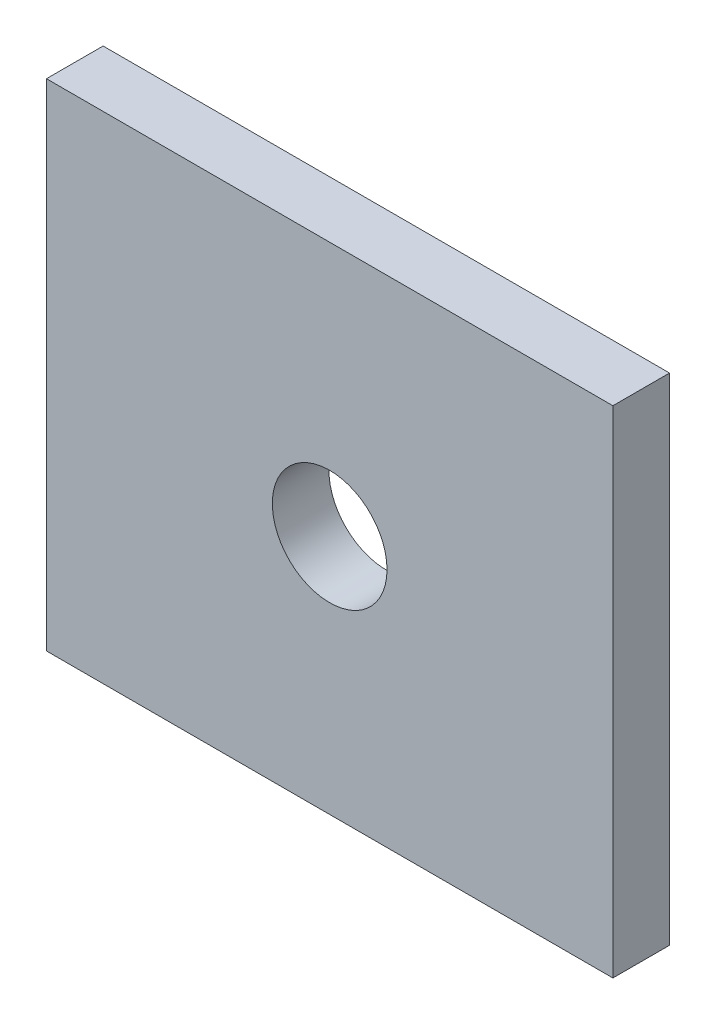
ISO-10303-21;
HEADER;
FILE_DESCRIPTION(('STEP AP214'),'2;1');
FILE_NAME('part.step','',(''),(''),'','','');
FILE_SCHEMA(('AUTOMOTIVE_DESIGN { 1 0 10303 214 1 1 1 1 }'));
ENDSEC;
DATA;
#1=APPLICATION_CONTEXT('core data for automotive mechanical design processes');
#2=APPLICATION_PROTOCOL_DEFINITION('international standard','automotive_design',2000,#1);
#3=PRODUCT_CONTEXT('',#1,'mechanical');
#4=PRODUCT('Part','Part','',(#3));
#5=PRODUCT_RELATED_PRODUCT_CATEGORY('part','',(#4));
#6=PRODUCT_DEFINITION_FORMATION('','',#4);
#7=PRODUCT_DEFINITION_CONTEXT('part definition',#1,'design');
#8=PRODUCT_DEFINITION('design','',#6,#7);
#9=PRODUCT_DEFINITION_SHAPE('','',#8);
#10=(LENGTH_UNIT() NAMED_UNIT(*) SI_UNIT(.MILLI.,.METRE.));
#11=(NAMED_UNIT(*) PLANE_ANGLE_UNIT() SI_UNIT($,.RADIAN.));
#12=(NAMED_UNIT(*) SI_UNIT($,.STERADIAN.) SOLID_ANGLE_UNIT());
#13=UNCERTAINTY_MEASURE_WITH_UNIT(LENGTH_MEASURE(1.E-05),#10,'distance_accuracy_value','');
#14=(GEOMETRIC_REPRESENTATION_CONTEXT(3) GLOBAL_UNCERTAINTY_ASSIGNED_CONTEXT((#13)) GLOBAL_UNIT_ASSIGNED_CONTEXT((#10,
#11,#12)) REPRESENTATION_CONTEXT('',''));
#15=CARTESIAN_POINT('',(0.,0.,0.));
#16=DIRECTION('',(0.,0.,1.));
#17=DIRECTION('',(1.,0.,0.));
#18=AXIS2_PLACEMENT_3D('',#15,#16,#17);
#19=CARTESIAN_POINT('',(0.,0.,0.));
#20=DIRECTION('',(0.,0.,-1.));
#21=DIRECTION('',(-1.,0.,0.));
#22=AXIS2_PLACEMENT_3D('',#19,#20,#21);
#23=PLANE('',#22);
#24=DIRECTION('',(0.,-1.,0.));
#25=VECTOR('',#24,1.);
#26=CARTESIAN_POINT('',(0.,0.,0.));
#27=LINE('',#26,#25);
#28=CARTESIAN_POINT('',(0.,35.,0.));
#29=VERTEX_POINT('',#28);
#30=CARTESIAN_POINT('',(0.,0.,0.));
#31=VERTEX_POINT('',#30);
#32=EDGE_CURVE('E112',#29,#31,#27,.T.);
#33=ORIENTED_EDGE('',*,*,#32,.F.);
#34=DIRECTION('',(-1.,0.,0.));
#35=VECTOR('',#34,1.);
#36=CARTESIAN_POINT('',(0.,35.,0.));
#37=LINE('',#36,#35);
#38=CARTESIAN_POINT('',(40.,35.,0.));
#39=VERTEX_POINT('',#38);
#40=EDGE_CURVE('E88',#39,#29,#37,.T.);
#41=ORIENTED_EDGE('',*,*,#40,.F.);
#42=DIRECTION('',(0.,1.,0.));
#43=VECTOR('',#42,1.);
#44=CARTESIAN_POINT('',(40.,0.,0.));
#45=LINE('',#44,#43);
#46=CARTESIAN_POINT('',(40.,0.,0.));
#47=VERTEX_POINT('',#46);
#48=EDGE_CURVE('E78',#47,#39,#45,.T.);
#49=ORIENTED_EDGE('',*,*,#48,.F.);
#50=DIRECTION('',(1.,0.,0.));
#51=VECTOR('',#50,1.);
#52=CARTESIAN_POINT('',(0.,0.,0.));
#53=LINE('',#52,#51);
#54=EDGE_CURVE('E105',#31,#47,#53,.T.);
#55=ORIENTED_EDGE('',*,*,#54,.F.);
#56=EDGE_LOOP('',(#33,#41,#49,#55));
#57=FACE_BOUND('',#56,.T.);
#58=CARTESIAN_POINT('',(24.05,17.,0.));
#59=CARTESIAN_POINT('',(24.0500051594344,17.0668176895687,0.));
#60=CARTESIAN_POINT('',(24.0484085186531,17.1336388053678,0.));
#61=CARTESIAN_POINT('',(24.0419805251838,17.2666462405184,0.));
#62=CARTESIAN_POINT('',(24.0371723601495,17.3328336847809,0.));
#63=CARTESIAN_POINT('',(24.0243225497178,17.4645746275891,0.));
#64=CARTESIAN_POINT('',(24.0162965270663,17.5301296441189,0.));
#65=CARTESIAN_POINT('',(23.9970204372372,17.660604950255,0.));
#66=CARTESIAN_POINT('',(23.9857780780867,17.7255263781261,0.));
#67=CARTESIAN_POINT('',(23.9600768873321,17.8547351580981,0.));
#68=CARTESIAN_POINT('',(23.9456177834944,17.9190224560511,0.));
#69=CARTESIAN_POINT('',(23.9134913767637,18.046964299905,0.));
#70=CARTESIAN_POINT('',(23.8958159842313,18.1106168134165,0.));
#71=CARTESIAN_POINT('',(23.8572642720424,18.2372911544053,0.));
#72=CARTESIAN_POINT('',(23.836372433031,18.3003082553091,0.));
#73=CARTESIAN_POINT('',(23.7913969572483,18.4257148362007,0.));
#74=CARTESIAN_POINT('',(23.7672909773259,18.4880962923317,0.));
#75=CARTESIAN_POINT('',(23.7161550534798,18.6115868218126,0.));
#76=CARTESIAN_POINT('',(23.689127621085,18.672696935056,0.));
#77=CARTESIAN_POINT('',(23.6323169381582,18.7930962372068,0.));
#78=CARTESIAN_POINT('',(23.6025545200407,18.8523952448006,0.));
#79=CARTESIAN_POINT('',(23.5402828377178,18.9691744724403,0.));
#80=CARTESIAN_POINT('',(23.5077871980815,19.0266619545779,0.));
#81=CARTESIAN_POINT('',(23.4400559477474,19.1398208127354,0.));
#82=CARTESIAN_POINT('',(23.4048267952394,19.1954960532865,0.));
#83=CARTESIAN_POINT('',(23.3316358399326,19.30503400182,0.));
#84=CARTESIAN_POINT('',(23.293673575563,19.3588964013835,0.));
#85=CARTESIAN_POINT('',(23.215023399167,19.4648130753522,0.));
#86=CARTESIAN_POINT('',(23.1743285642873,19.5168622077636,0.));
#87=CARTESIAN_POINT('',(23.0902191398471,19.6191569889673,0.));
#88=CARTESIAN_POINT('',(23.0467918038281,19.6693921527858,0.));
#89=CARTESIAN_POINT('',(22.9572248760564,19.7680655843681,0.));
#90=CARTESIAN_POINT('',(22.9110675116456,19.8164877058103,0.));
#91=CARTESIAN_POINT('',(22.8165517968192,19.9110228297798,0.));
#92=CARTESIAN_POINT('',(22.7681960387293,19.9571384238973,0.));
#93=CARTESIAN_POINT('',(22.6696351105272,20.0466324852595,0.));
#94=CARTESIAN_POINT('',(22.6194454310532,20.090027997457,0.));
#95=CARTESIAN_POINT('',(22.5172243914948,20.1740875633347,0.));
#96=CARTESIAN_POINT('',(22.4652028395331,20.214763539953,0.));
#97=CARTESIAN_POINT('',(22.3593233117026,20.2933890739011,0.));
#98=CARTESIAN_POINT('',(22.3054698235642,20.3313446730675,0.));
#99=CARTESIAN_POINT('',(22.1959318376483,20.4045355735259,0.));
#100=CARTESIAN_POINT('',(22.1402470314627,20.4397704132412,0.));
#101=CARTESIAN_POINT('',(22.0270511875206,20.5075265416123,0.));
#102=CARTESIAN_POINT('',(21.9695357216347,20.5400404304214,0.));
#103=CARTESIAN_POINT('',(21.8526822277578,20.6023612016575,0.));
#104=CARTESIAN_POINT('',(21.7933364360018,20.6321535193745,0.));
#105=CARTESIAN_POINT('',(21.672826697206,20.6890401039135,0.));
#106=CARTESIAN_POINT('',(21.6116525093002,20.7161126521768,0.));
#107=CARTESIAN_POINT('',(21.48815434914,20.7672821201414,0.));
#108=CARTESIAN_POINT('',(21.4258317801236,20.7913824261999,0.));
#109=CARTESIAN_POINT('',(21.3005254612771,20.836346523475,0.));
#110=CARTESIAN_POINT('',(21.2375495001096,20.8572319901855,0.));
#111=CARTESIAN_POINT('',(21.1109413706757,20.8957746043325,0.));
#112=CARTESIAN_POINT('',(21.047313701222,20.9134465205337,0.));
#113=CARTESIAN_POINT('',(20.9194050833449,20.9455687009538,0.));
#114=CARTESIAN_POINT('',(20.8551259689329,20.9600262644821,0.));
#115=CARTESIAN_POINT('',(20.7259171207073,20.985727466957,0.));
#116=CARTESIAN_POINT('',(20.6609872785995,20.9969705614396,0.));
#117=CARTESIAN_POINT('',(20.5304788074472,21.0162508875548,0.));
#118=CARTESIAN_POINT('',(20.4648989191434,21.0242795880486,0.));
#119=CARTESIAN_POINT('',(20.3330912412038,21.0371385769234,0.));
#120=CARTESIAN_POINT('',(20.2668618524577,21.0419524382029,0.));
#121=CARTESIAN_POINT('',(20.133755817889,21.0483917088574,0.));
#122=CARTESIAN_POINT('',(20.0668780220726,21.0499931338911,0.));
#123=CARTESIAN_POINT('',(19.9331988919648,21.0500068582125,0.));
#124=CARTESIAN_POINT('',(19.8663975581935,21.0484228230823,0.));
#125=CARTESIAN_POINT('',(19.7334225998384,21.0420115800598,0.));
#126=CARTESIAN_POINT('',(19.6672478761883,21.0372073783046,0.));
#127=CARTESIAN_POINT('',(19.5355275968806,21.0243652771076,0.));
#128=CARTESIAN_POINT('',(19.4699805458226,21.0163427438463,0.));
#129=CARTESIAN_POINT('',(19.3395157654759,20.9970712599578,0.));
#130=CARTESIAN_POINT('',(19.2745969372681,20.9858297548591,0.));
#131=CARTESIAN_POINT('',(19.1453881025941,20.9601284842557,0.));
#132=CARTESIAN_POINT('',(19.0810982044346,20.9456681742895,0.));
#133=CARTESIAN_POINT('',(18.9531458377427,20.9135374432741,0.));
#134=CARTESIAN_POINT('',(18.889485470532,20.8958586585827,0.));
#135=CARTESIAN_POINT('',(18.7627901326564,20.8572982006067,0.));
#136=CARTESIAN_POINT('',(18.6997599709858,20.8364007387062,0.));
#137=CARTESIAN_POINT('',(18.574321827798,20.7914123748907,0.));
#138=CARTESIAN_POINT('',(18.5119219622352,20.7672988742499,0.));
#139=CARTESIAN_POINT('',(18.3884132979337,20.7161547655237,0.));
#140=CARTESIAN_POINT('',(18.3273030969179,20.6891275441936,0.));
#141=CARTESIAN_POINT('',(18.2069037310416,20.6323170145044,0.));
#142=CARTESIAN_POINT('',(18.1476047467087,20.6025545404502,0.));
#143=CARTESIAN_POINT('',(18.0308255360038,20.5402828174019,0.));
#144=CARTESIAN_POINT('',(17.9733380476793,20.5077871926423,0.));
#145=CARTESIAN_POINT('',(17.8601791850042,20.4400559531707,0.));
#146=CARTESIAN_POINT('',(17.8045039461045,20.4048267966915,0.));
#147=CARTESIAN_POINT('',(17.6949659987802,20.3316358384766,0.));
#148=CARTESIAN_POINT('',(17.6411035987744,20.293673575171,0.));
#149=CARTESIAN_POINT('',(17.5351869244811,20.2150233995566,0.));
#150=CARTESIAN_POINT('',(17.483137792189,20.1743285643909,0.));
#151=CARTESIAN_POINT('',(17.3808430110736,20.0902191397403,0.));
#152=CARTESIAN_POINT('',(17.3306078472236,20.0467918037987,0.));
#153=CARTESIAN_POINT('',(17.2319344156186,19.9572248760844,0.));
#154=CARTESIAN_POINT('',(17.1835122941859,19.9110675116529,0.));
#155=CARTESIAN_POINT('',(17.0889771702231,19.8165517968108,0.));
#156=CARTESIAN_POINT('',(17.042861576103,19.7681960387259,0.));
#157=CARTESIAN_POINT('',(16.9533675147387,19.6696351105267,0.));
#158=CARTESIAN_POINT('',(16.9099720025415,19.6194454310507,0.));
#159=CARTESIAN_POINT('',(16.825912436664,19.5172243914906,0.));
#160=CARTESIAN_POINT('',(16.7852364600454,19.465202839529,0.));
#161=CARTESIAN_POINT('',(16.7066109260971,19.3593233116984,0.));
#162=CARTESIAN_POINT('',(16.6686553269307,19.3054698235598,0.));
#163=CARTESIAN_POINT('',(16.5954644264723,19.1959318376438,0.));
#164=CARTESIAN_POINT('',(16.5602295867571,19.1402470314583,0.));
#165=CARTESIAN_POINT('',(16.492473458386,19.0270511875166,0.));
#166=CARTESIAN_POINT('',(16.4599595695771,18.969535721631,0.));
#167=CARTESIAN_POINT('',(16.3976387983413,18.8526822277548,0.));
#168=CARTESIAN_POINT('',(16.3678464806244,18.7933364359994,0.));
#169=CARTESIAN_POINT('',(16.3109598960859,18.6728266972047,0.));
#170=CARTESIAN_POINT('',(16.2838873478229,18.6116525092996,0.));
#171=CARTESIAN_POINT('',(16.2327178798584,18.4881543491395,0.));
#172=CARTESIAN_POINT('',(16.2086175737997,18.4258317801227,0.));
#173=CARTESIAN_POINT('',(16.1636534765243,18.3005254612753,0.));
#174=CARTESIAN_POINT('',(16.1427680098136,18.2375495001075,0.));
#175=CARTESIAN_POINT('',(16.1042253956664,18.1109413706731,0.));
#176=CARTESIAN_POINT('',(16.0865534794651,18.0473137012192,0.));
#177=CARTESIAN_POINT('',(16.0544312990449,17.9194050833418,0.));
#178=CARTESIAN_POINT('',(16.0399737355166,17.8551259689297,0.));
#179=CARTESIAN_POINT('',(16.0142725330417,17.7259171207042,0.));
#180=CARTESIAN_POINT('',(16.0030294385591,17.6609872785965,0.));
#181=CARTESIAN_POINT('',(15.983749112444,17.5304788074444,0.));
#182=CARTESIAN_POINT('',(15.9757204119503,17.4648989191408,0.));
#183=CARTESIAN_POINT('',(15.9628614230757,17.3330912412017,0.));
#184=CARTESIAN_POINT('',(15.9580475617964,17.266861852456,0.));
#185=CARTESIAN_POINT('',(15.9516082911422,17.1337558178881,0.));
#186=CARTESIAN_POINT('',(15.9500068661087,17.0668780220721,0.));
#187=CARTESIAN_POINT('',(15.9499931417877,16.9331988919646,0.));
#188=CARTESIAN_POINT('',(15.9515771769181,16.8663975581931,0.));
#189=CARTESIAN_POINT('',(15.957988419941,16.7334225998378,0.));
#190=CARTESIAN_POINT('',(15.9627926216963,16.6672478761875,0.));
#191=CARTESIAN_POINT('',(15.9756347228935,16.5355275968796,0.));
#192=CARTESIAN_POINT('',(15.9836572561549,16.4699805458216,0.));
#193=CARTESIAN_POINT('',(16.0029287400435,16.3395157654748,0.));
#194=CARTESIAN_POINT('',(16.0141702451423,16.2745969372669,0.));
#195=CARTESIAN_POINT('',(16.0398715157456,16.145388102593,0.));
#196=CARTESIAN_POINT('',(16.0543318257118,16.0810982044334,0.));
#197=CARTESIAN_POINT('',(16.0864625567271,15.9531458377416,0.));
#198=CARTESIAN_POINT('',(16.1041413414184,15.889485470531,0.));
#199=CARTESIAN_POINT('',(16.1427017993942,15.7627901326556,0.));
#200=CARTESIAN_POINT('',(16.1635992612945,15.6997599709852,0.));
#201=CARTESIAN_POINT('',(16.2085876251097,15.5743218277977,0.));
#202=CARTESIAN_POINT('',(16.2327011257503,15.5119219622351,0.));
#203=CARTESIAN_POINT('',(16.283845234476,15.3884132979342,0.));
#204=CARTESIAN_POINT('',(16.3108724558057,15.3273030969189,0.));
#205=CARTESIAN_POINT('',(16.3676829854943,15.2069037310436,0.));
#206=CARTESIAN_POINT('',(16.3974454595482,15.147604746711,0.));
#207=CARTESIAN_POINT('',(16.4597171825962,15.0308255360068,0.));
#208=CARTESIAN_POINT('',(16.4922128073556,14.9733380476825,0.));
#209=CARTESIAN_POINT('',(16.5599440468271,14.8601791850078,0.));
#210=CARTESIAN_POINT('',(16.5951732033062,14.8045039461081,0.));
#211=CARTESIAN_POINT('',(16.6683641615211,14.6949659987838,0.));
#212=CARTESIAN_POINT('',(16.7063264248268,14.6411035987779,0.));
#213=CARTESIAN_POINT('',(16.7849766004414,14.5351869244843,0.));
#214=CARTESIAN_POINT('',(16.8256714356072,14.483137792192,0.));
#215=CARTESIAN_POINT('',(16.9097808602582,14.380843011076,0.));
#216=CARTESIAN_POINT('',(16.9532081962001,14.3306078472256,0.));
#217=CARTESIAN_POINT('',(17.0427751239149,14.2319344156197,0.));
#218=CARTESIAN_POINT('',(17.0889324883467,14.1835122941864,0.));
#219=CARTESIAN_POINT('',(17.1834482031885,14.0889771702236,0.));
#220=CARTESIAN_POINT('',(17.2318039612728,14.0428615761039,0.));
#221=CARTESIAN_POINT('',(17.3303648894709,13.9533675147403,0.));
#222=CARTESIAN_POINT('',(17.3805545689464,13.9099720025435,0.));
#223=CARTESIAN_POINT('',(17.4827756085059,13.8259124366665,0.));
#224=CARTESIAN_POINT('',(17.5347971604672,13.785236460048,0.));
#225=CARTESIAN_POINT('',(17.6406766882974,13.7066109261,0.));
#226=CARTESIAN_POINT('',(17.694530176436,13.6686553269336,0.));
#227=CARTESIAN_POINT('',(17.8040681623519,13.5954644264752,0.));
#228=CARTESIAN_POINT('',(17.8597529685375,13.56022958676,0.));
#229=CARTESIAN_POINT('',(17.9729488124796,13.4924734583887,0.));
#230=CARTESIAN_POINT('',(18.0304642783655,13.4599595695795,0.));
#231=CARTESIAN_POINT('',(18.1473177722424,13.3976387983433,0.));
#232=CARTESIAN_POINT('',(18.2066635639983,13.3678464806261,0.));
#233=CARTESIAN_POINT('',(18.3271733027941,13.3109598960868,0.));
#234=CARTESIAN_POINT('',(18.3883474906998,13.2838873478233,0.));
#235=CARTESIAN_POINT('',(18.5118456508598,13.2327178798585,0.));
#236=CARTESIAN_POINT('',(18.574168219876,13.2086175737999,0.));
#237=CARTESIAN_POINT('',(18.6994745387222,13.1636534765246,0.));
#238=CARTESIAN_POINT('',(18.7624504998895,13.142768009814,0.));
#239=CARTESIAN_POINT('',(18.8890586293232,13.1042253956669,0.));
#240=CARTESIAN_POINT('',(18.9526862987769,13.0865534794657,0.));
#241=CARTESIAN_POINT('',(19.0805949166539,13.0544312990455,0.));
#242=CARTESIAN_POINT('',(19.1448740310658,13.0399737355172,0.));
#243=CARTESIAN_POINT('',(19.2740828792914,13.0142725330423,0.));
#244=CARTESIAN_POINT('',(19.3390127213992,13.0030294385598,0.));
#245=CARTESIAN_POINT('',(19.4695211925516,12.9837491124446,0.));
#246=CARTESIAN_POINT('',(19.5351010808556,12.9757204119508,0.));
#247=CARTESIAN_POINT('',(19.6669087587954,12.9628614230761,0.));
#248=CARTESIAN_POINT('',(19.7331381475416,12.9580475617968,0.));
#249=CARTESIAN_POINT('',(19.8662441821106,12.9516082911424,0.));
#250=CARTESIAN_POINT('',(19.9331219779272,12.9500068661088,0.));
#251=CARTESIAN_POINT('',(20.0668011080353,12.9499931417876,0.));
#252=CARTESIAN_POINT('',(20.1336024418066,12.9515771769179,0.));
#253=CARTESIAN_POINT('',(20.2665774001617,12.9579884199406,0.));
#254=CARTESIAN_POINT('',(20.3327521238119,12.9627926216958,0.));
#255=CARTESIAN_POINT('',(20.4644724031196,12.975634722893,0.));
#256=CARTESIAN_POINT('',(20.5300194541776,12.9836572561543,0.));
#257=CARTESIAN_POINT('',(20.6604842345243,13.0029287400428,0.));
#258=CARTESIAN_POINT('',(20.7254030627322,13.0141702451416,0.));
#259=CARTESIAN_POINT('',(20.8546118974061,13.039871515745,0.));
#260=CARTESIAN_POINT('',(20.9189017955657,13.0543318257112,0.));
#261=CARTESIAN_POINT('',(21.0468541622575,13.0864625567265,0.));
#262=CARTESIAN_POINT('',(21.1105145294682,13.1041413414179,0.));
#263=CARTESIAN_POINT('',(21.2372098673438,13.1427017993937,0.));
#264=CARTESIAN_POINT('',(21.3002400290143,13.1635992612942,0.));
#265=CARTESIAN_POINT('',(21.425678172202,13.2085876251095,0.));
#266=CARTESIAN_POINT('',(21.4880780377648,13.2327011257502,0.));
#267=CARTESIAN_POINT('',(21.6115867020659,13.283845234476,0.));
#268=CARTESIAN_POINT('',(21.6726969030812,13.3108724558059,0.));
#269=CARTESIAN_POINT('',(21.7930962689566,13.3676829854946,0.));
#270=CARTESIAN_POINT('',(21.8523952532893,13.3974454595486,0.));
#271=CARTESIAN_POINT('',(21.9691744639936,13.4597171825966,0.));
#272=CARTESIAN_POINT('',(22.0266619523179,13.492212807356,0.));
#273=CARTESIAN_POINT('',(22.1398208149927,13.5599440468276,0.));
#274=CARTESIAN_POINT('',(22.1954960538924,13.5951732033067,0.));
#275=CARTESIAN_POINT('',(22.3050340012167,13.6683641615215,0.));
#276=CARTESIAN_POINT('',(22.3588964012227,13.7063264248271,0.));
#277=CARTESIAN_POINT('',(22.464813075516,13.7849766004418,0.));
#278=CARTESIAN_POINT('',(22.5168622078079,13.8256714356078,0.));
#279=CARTESIAN_POINT('',(22.6191569889248,13.9097808602583,0.));
#280=CARTESIAN_POINT('',(22.6693921527767,13.9532081961995,0.));
#281=CARTESIAN_POINT('',(22.7680655843784,14.0427751239159,0.));
#282=CARTESIAN_POINT('',(22.816487705806,14.08893248835,0.));
#283=CARTESIAN_POINT('',(22.9110228297844,14.1834482031856,0.));
#284=CARTESIAN_POINT('',(22.9571384239254,14.2318039612615,0.));
#285=CARTESIAN_POINT('',(23.0466324852324,14.3303648894839,0.));
#286=CARTESIAN_POINT('',(23.0900279973522,14.3805545689918,0.));
#287=CARTESIAN_POINT('',(23.1740875634404,14.4827756084637,0.));
#288=CARTESIAN_POINT('',(23.2147635403454,14.5347971603057,0.));
#289=CARTESIAN_POINT('',(23.2933890735113,14.6406766884623,0.));
#290=CARTESIAN_POINT('',(23.331344671612,14.6945301770452,0.));
#291=CARTESIAN_POINT('',(23.4045355749835,14.8040681617466,0.));
#292=CARTESIAN_POINT('',(23.4397704186782,14.859752966273,0.));
#293=CARTESIAN_POINT('',(23.5075265361627,14.9729488147539,0.));
#294=CARTESIAN_POINT('',(23.5400404100558,15.0304642868584,0.));
#295=CARTESIAN_POINT('',(23.6023612221277,15.1473177637094,0.));
#296=CARTESIAN_POINT('',(23.6321535959554,15.2066635320712,0.));
#297=CARTESIAN_POINT('',(23.6890400267638,15.3271733349604,0.));
#298=CARTESIAN_POINT('',(23.7161123632045,15.3883476111798,0.));
#299=CARTESIAN_POINT('',(23.7672900265121,15.5118639157649,0.));
#300=CARTESIAN_POINT('',(23.7913978630618,15.5742049041708,0.));
#301=CARTESIAN_POINT('',(23.8363748673374,15.6995428041254,0.));
#302=CARTESIAN_POINT('',(23.8572659671738,15.7625318344747,0.));
#303=CARTESIAN_POINT('',(23.8958173310262,15.8891609698393,0.));
#304=CARTESIAN_POINT('',(23.913492633604,15.9527964935043,0.));
#305=CARTESIAN_POINT('',(23.9456191718753,16.0807156511551,0.));
#306=CARTESIAN_POINT('',(23.960077981065,16.1449973820791,0.));
#307=CARTESIAN_POINT('',(23.9857791595048,16.2742062446699,0.));
#308=CARTESIAN_POINT('',(23.9970212565105,16.3391334304835,0.));
#309=CARTESIAN_POINT('',(24.0162973592468,16.4696315208899,0.));
#310=CARTESIAN_POINT('',(24.0243230976489,16.5352036460767,0.));
#311=CARTESIAN_POINT('',(24.0371729101897,16.6669900823728,0.));
#312=CARTESIAN_POINT('',(24.0419808009881,16.7332059652103,0.));
#313=CARTESIAN_POINT('',(24.0484087827259,16.8662816358268,0.));
#314=CARTESIAN_POINT('',(24.0500051386186,16.9331425745986,0.));
#315=CARTESIAN_POINT('',(24.05,17.,0.));
#316=B_SPLINE_CURVE_WITH_KNOTS('',3,(#58,#59,#60,#61,#62,#63,#64,#65,#66,#67,#68,#69,#70,#71,
#72,#73,#74,#75,#76,#77,#78,#79,#80,#81,#82,#83,#84,#85,#86,#87,#88,#89,#90,#91,#92,#93,#94,#95,
#96,#97,#98,#99,#100,#101,#102,#103,#104,#105,#106,#107,#108,#109,#110,#111,#112,#113,#114,#115,
#116,#117,#118,#119,#120,#121,#122,#123,#124,#125,#126,#127,#128,#129,#130,#131,#132,#133,#134,
#135,#136,#137,#138,#139,#140,#141,#142,#143,#144,#145,#146,#147,#148,#149,#150,#151,#152,#153,
#154,#155,#156,#157,#158,#159,#160,#161,#162,#163,#164,#165,#166,#167,#168,#169,#170,#171,#172,
#173,#174,#175,#176,#177,#178,#179,#180,#181,#182,#183,#184,#185,#186,#187,#188,#189,#190,#191,
#192,#193,#194,#195,#196,#197,#198,#199,#200,#201,#202,#203,#204,#205,#206,#207,#208,#209,#210,
#211,#212,#213,#214,#215,#216,#217,#218,#219,#220,#221,#222,#223,#224,#225,#226,#227,#228,#229,
#230,#231,#232,#233,#234,#235,#236,#237,#238,#239,#240,#241,#242,#243,#244,#245,#246,#247,#248,
#249,#250,#251,#252,#253,#254,#255,#256,#257,#258,#259,#260,#261,#262,#263,#264,#265,#266,#267,
#268,#269,#270,#271,#272,#273,#274,#275,#276,#277,#278,#279,#280,#281,#282,#283,#284,#285,#286,
#287,#288,#289,#290,#291,#292,#293,#294,#295,#296,#297,#298,#299,#300,#301,#302,#303,#304,#305,
#306,#307,#308,#309,#310,#311,#312,#313,#314,#315),.UNSPECIFIED.,.F.,.F.,(4,2,2,2,2,2,2,2,2,2,2,
2,2,2,2,2,2,2,2,2,2,2,2,2,2,2,2,2,2,2,2,2,2,2,2,2,2,2,2,2,2,2,2,2,2,2,2,2,2,2,2,2,2,2,2,2,2,2,2,
2,2,2,2,2,2,2,2,2,2,2,2,2,2,2,2,2,2,2,2,2,2,2,2,2,2,2,2,2,2,2,2,2,2,2,2,2,2,2,2,2,2,2,2,2,2,2,2,
2,2,2,2,2,2,2,2,2,2,2,2,2,2,2,2,2,2,2,2,2,4),(0.,0.200438788959246,0.399445804150207,
0.597498116013453,0.795079710644465,0.992678033013082,1.1907804046098,1.38987044560882,
1.59042463125733,1.79080775447527,1.9897743084256,2.1878019770374,2.38537525434341,
2.58298197664734,2.78110973320515,2.98024228594882,3.18085612801974,3.38123925123788,
3.58020580518834,3.77823347380021,3.97580675110624,4.17341347341016,4.37154122996793,
4.57067378271155,4.77128762478241,4.97167074800032,5.17063730195063,5.36866497056243,
5.56623824786843,5.76384497017236,5.96197272673018,6.16110527947386,6.36171912154478,
6.56210224476265,6.76106879871292,6.95909646732467,7.15666974463066,7.35427646693462,
7.5524042234925,7.75153677623632,7.95215061830746,8.15253374152754,8.35150029547941,
8.54952796409212,8.74710124139843,8.94470796370207,9.14283572025899,9.3419682730012,
9.54258211507011,9.74296523829026,9.94193179224218,10.1399594608549,10.3375327381613,
10.5351394604649,10.7332672170217,10.9323997697638,11.1330136118325,11.333396735052,
11.5323632890034,11.7303909576158,11.927964234922,12.1255709572257,12.3236987137829,
12.5228312665256,12.7234451085951,12.9238282318135,13.1227947857642,13.3208224543762,
13.5183957316823,13.7160024539861,13.9141302105437,14.1132627632871,14.3138766053575,
14.5142597285757,14.7132262825262,14.9112539511381,15.1088272284441,15.306433950748,
15.5045617073058,15.7036942600493,15.9043081021201,16.104691225338,16.3036577792882,
16.5016854479,16.699258725206,16.89686544751,17.0949932040678,17.2941257568115,17.4947395988825,
17.6951227221,17.89408927605,18.0921169446616,18.2896902219675,18.4872969442715,
18.6854247008295,18.8845572535736,19.0851710956451,19.2855542188631,19.4845207728135,
19.6825484414253,19.8801217187313,20.0777284410352,20.275856197593,20.4749887503367,
20.6756025924076,20.8759857156261,21.0749522695768,21.2729799381888,21.4705532154949,
21.6681599377988,21.8662876943564,22.0654202470997,22.2660340891702,22.4664172123894,
22.6653837663406,22.8634114349529,23.0609847122591,23.2585914345628,23.4567191911201,
23.655851743863,23.8564655859328,24.0569084059285,24.2559175000005,24.4539705701364,
24.6515522527099,24.8491506525472,25.047253750906,25.2463458179801,25.4469039601627),.UNSPECIFIED.);
#317=CARTESIAN_POINT('',(24.05,17.,0.));
#318=VERTEX_POINT('',#317);
#319=EDGE_CURVE('E111',#318,#318,#316,.T.);
#320=ORIENTED_EDGE('',*,*,#319,.T.);
#321=EDGE_LOOP('',(#320));
#322=FACE_BOUND('',#321,.T.);
#323=ADVANCED_FACE('F45',(#57,#322),#23,.T.);
#324=CARTESIAN_POINT('',(0.,0.,4.));
#325=DIRECTION('',(1.,0.,0.));
#326=DIRECTION('',(0.,0.,-1.));
#327=AXIS2_PLACEMENT_3D('',#324,#325,#326);
#328=PLANE('',#327);
#329=ORIENTED_EDGE('',*,*,#32,.T.);
#330=DIRECTION('',(0.,0.,-1.));
#331=VECTOR('',#330,1.);
#332=CARTESIAN_POINT('',(0.,0.,4.));
#333=LINE('',#332,#331);
#334=CARTESIAN_POINT('',(0.,0.,4.));
#335=VERTEX_POINT('',#334);
#336=EDGE_CURVE('E11',#335,#31,#333,.T.);
#337=ORIENTED_EDGE('',*,*,#336,.F.);
#338=DIRECTION('',(0.,-1.,0.));
#339=VECTOR('',#338,1.);
#340=CARTESIAN_POINT('',(0.,0.,4.));
#341=LINE('',#340,#339);
#342=CARTESIAN_POINT('',(0.,35.,4.));
#343=VERTEX_POINT('',#342);
#344=EDGE_CURVE('E98',#343,#335,#341,.T.);
#345=ORIENTED_EDGE('',*,*,#344,.F.);
#346=DIRECTION('',(0.,0.,-1.));
#347=VECTOR('',#346,1.);
#348=CARTESIAN_POINT('',(0.,35.,4.));
#349=LINE('',#348,#347);
#350=EDGE_CURVE('E110',#343,#29,#349,.T.);
#351=ORIENTED_EDGE('',*,*,#350,.T.);
#352=EDGE_LOOP('',(#329,#337,#345,#351));
#353=FACE_BOUND('',#352,.T.);
#354=ADVANCED_FACE('F42',(#353),#328,.F.);
#355=CARTESIAN_POINT('',(0.,0.,4.));
#356=DIRECTION('',(0.,1.,0.));
#357=DIRECTION('',(0.,0.,1.));
#358=AXIS2_PLACEMENT_3D('',#355,#356,#357);
#359=PLANE('',#358);
#360=ORIENTED_EDGE('',*,*,#54,.T.);
#361=DIRECTION('',(0.,0.,-1.));
#362=VECTOR('',#361,1.);
#363=CARTESIAN_POINT('',(40.,0.,4.));
#364=LINE('',#363,#362);
#365=CARTESIAN_POINT('',(40.,0.,4.));
#366=VERTEX_POINT('',#365);
#367=EDGE_CURVE('E53',#366,#47,#364,.T.);
#368=ORIENTED_EDGE('',*,*,#367,.F.);
#369=DIRECTION('',(1.,0.,0.));
#370=VECTOR('',#369,1.);
#371=CARTESIAN_POINT('',(0.,0.,4.));
#372=LINE('',#371,#370);
#373=EDGE_CURVE('E91',#335,#366,#372,.T.);
#374=ORIENTED_EDGE('',*,*,#373,.F.);
#375=ORIENTED_EDGE('',*,*,#336,.T.);
#376=EDGE_LOOP('',(#360,#368,#374,#375));
#377=FACE_BOUND('',#376,.T.);
#378=ADVANCED_FACE('F101',(#377),#359,.F.);
#379=CARTESIAN_POINT('',(40.,0.,4.));
#380=DIRECTION('',(-1.,0.,0.));
#381=DIRECTION('',(0.,0.,1.));
#382=AXIS2_PLACEMENT_3D('',#379,#380,#381);
#383=PLANE('',#382);
#384=ORIENTED_EDGE('',*,*,#48,.T.);
#385=DIRECTION('',(0.,0.,-1.));
#386=VECTOR('',#385,1.);
#387=CARTESIAN_POINT('',(40.,35.,4.));
#388=LINE('',#387,#386);
#389=CARTESIAN_POINT('',(40.,35.,4.));
#390=VERTEX_POINT('',#389);
#391=EDGE_CURVE('E103',#390,#39,#388,.T.);
#392=ORIENTED_EDGE('',*,*,#391,.F.);
#393=DIRECTION('',(0.,1.,0.));
#394=VECTOR('',#393,1.);
#395=CARTESIAN_POINT('',(40.,0.,4.));
#396=LINE('',#395,#394);
#397=EDGE_CURVE('E96',#366,#390,#396,.T.);
#398=ORIENTED_EDGE('',*,*,#397,.F.);
#399=ORIENTED_EDGE('',*,*,#367,.T.);
#400=EDGE_LOOP('',(#384,#392,#398,#399));
#401=FACE_BOUND('',#400,.T.);
#402=ADVANCED_FACE('F104',(#401),#383,.F.);
#403=CARTESIAN_POINT('',(0.,35.,4.));
#404=DIRECTION('',(0.,-1.,0.));
#405=DIRECTION('',(0.,0.,-1.));
#406=AXIS2_PLACEMENT_3D('',#403,#404,#405);
#407=PLANE('',#406);
#408=ORIENTED_EDGE('',*,*,#40,.T.);
#409=ORIENTED_EDGE('',*,*,#350,.F.);
#410=DIRECTION('',(-1.,0.,0.));
#411=VECTOR('',#410,1.);
#412=CARTESIAN_POINT('',(0.,35.,4.));
#413=LINE('',#412,#411);
#414=EDGE_CURVE('E64',#390,#343,#413,.T.);
#415=ORIENTED_EDGE('',*,*,#414,.F.);
#416=ORIENTED_EDGE('',*,*,#391,.T.);
#417=EDGE_LOOP('',(#408,#409,#415,#416));
#418=FACE_BOUND('',#417,.T.);
#419=ADVANCED_FACE('F141',(#418),#407,.F.);
#420=CARTESIAN_POINT('',(0.,0.,4.));
#421=DIRECTION('',(0.,0.,-1.));
#422=DIRECTION('',(-1.,0.,0.));
#423=AXIS2_PLACEMENT_3D('',#420,#421,#422);
#424=PLANE('',#423);
#425=CARTESIAN_POINT('',(20.,17.,4.));
#426=DIRECTION('',(0.,0.,1.));
#427=DIRECTION('',(1.,0.,0.));
#428=AXIS2_PLACEMENT_3D('',#425,#426,#427);
#429=CIRCLE('',#428,4.05);
#430=CARTESIAN_POINT('',(24.05,17.,4.));
#431=VERTEX_POINT('',#430);
#432=EDGE_CURVE('E123',#431,#431,#429,.T.);
#433=ORIENTED_EDGE('',*,*,#432,.F.);
#434=EDGE_LOOP('',(#433));
#435=FACE_BOUND('',#434,.T.);
#436=ORIENTED_EDGE('',*,*,#344,.T.);
#437=ORIENTED_EDGE('',*,*,#373,.T.);
#438=ORIENTED_EDGE('',*,*,#397,.T.);
#439=ORIENTED_EDGE('',*,*,#414,.T.);
#440=EDGE_LOOP('',(#436,#437,#438,#439));
#441=FACE_BOUND('',#440,.T.);
#442=ADVANCED_FACE('F94',(#435,#441),#424,.F.);
#443=CARTESIAN_POINT('',(20.,17.,-1.2E-05));
#444=DIRECTION('',(0.,0.,1.));
#445=DIRECTION('',(1.,0.,0.));
#446=AXIS2_PLACEMENT_3D('',#443,#444,#445);
#447=CYLINDRICAL_SURFACE('',#446,4.05);
#448=ORIENTED_EDGE('',*,*,#319,.F.);
#449=EDGE_LOOP('',(#448));
#450=FACE_BOUND('',#449,.T.);
#451=ORIENTED_EDGE('',*,*,#432,.T.);
#452=EDGE_LOOP('',(#451));
#453=FACE_BOUND('',#452,.T.);
#454=ADVANCED_FACE('F134',(#450,#453),#447,.F.);
#455=CLOSED_SHELL('',(#323,#354,#378,#402,#419,#442,#454));
#456=MANIFOLD_SOLID_BREP('B2',#455);
#457=ADVANCED_BREP_SHAPE_REPRESENTATION('',(#18,#456),#14);
#458=SHAPE_DEFINITION_REPRESENTATION(#9,#457);
ENDSEC;
END-ISO-10303-21;
